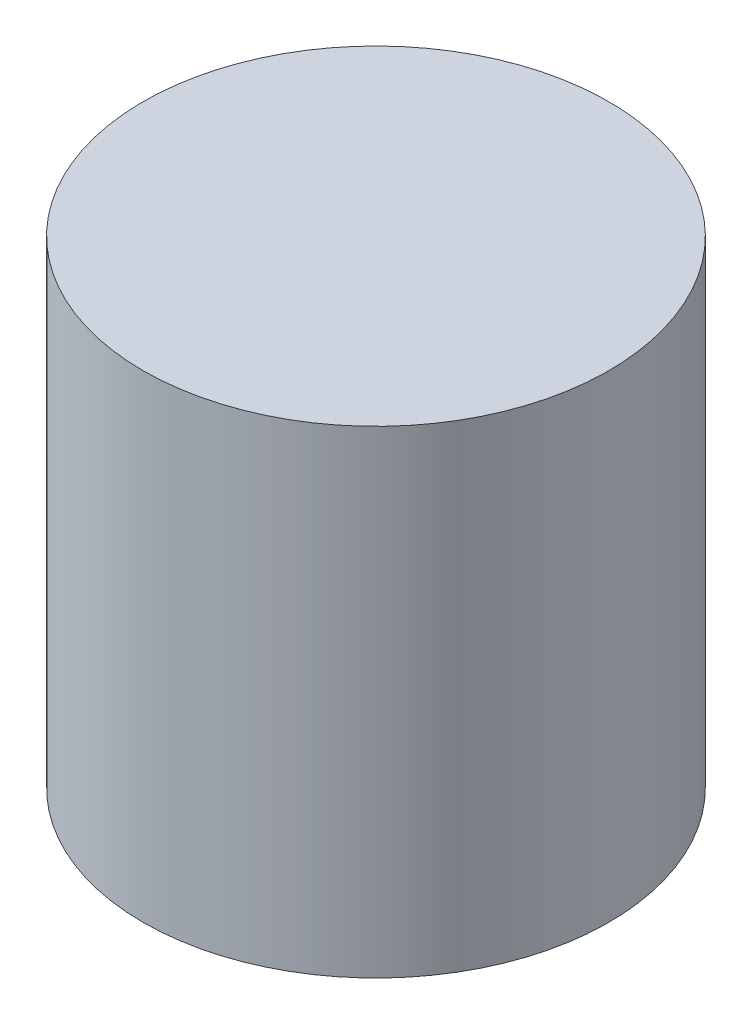
ISO-10303-21;
HEADER;
FILE_DESCRIPTION(('STEP AP214'),'2;1');
FILE_NAME('part.step','',(''),(''),'','','');
FILE_SCHEMA(('AUTOMOTIVE_DESIGN { 1 0 10303 214 1 1 1 1 }'));
ENDSEC;
DATA;
#1=APPLICATION_CONTEXT('core data for automotive mechanical design processes');
#2=APPLICATION_PROTOCOL_DEFINITION('international standard','automotive_design',2000,#1);
#3=PRODUCT_CONTEXT('',#1,'mechanical');
#4=PRODUCT('Part','Part','',(#3));
#5=PRODUCT_RELATED_PRODUCT_CATEGORY('part','',(#4));
#6=PRODUCT_DEFINITION_FORMATION('','',#4);
#7=PRODUCT_DEFINITION_CONTEXT('part definition',#1,'design');
#8=PRODUCT_DEFINITION('design','',#6,#7);
#9=PRODUCT_DEFINITION_SHAPE('','',#8);
#10=(LENGTH_UNIT() NAMED_UNIT(*) SI_UNIT(.MILLI.,.METRE.));
#11=(NAMED_UNIT(*) PLANE_ANGLE_UNIT() SI_UNIT($,.RADIAN.));
#12=(NAMED_UNIT(*) SI_UNIT($,.STERADIAN.) SOLID_ANGLE_UNIT());
#13=UNCERTAINTY_MEASURE_WITH_UNIT(LENGTH_MEASURE(1.E-05),#10,'distance_accuracy_value','');
#14=(GEOMETRIC_REPRESENTATION_CONTEXT(3) GLOBAL_UNCERTAINTY_ASSIGNED_CONTEXT((#13)) GLOBAL_UNIT_ASSIGNED_CONTEXT((#10,
#11,#12)) REPRESENTATION_CONTEXT('',''));
#15=CARTESIAN_POINT('',(0.,0.,0.));
#16=DIRECTION('',(0.,0.,1.));
#17=DIRECTION('',(1.,0.,0.));
#18=AXIS2_PLACEMENT_3D('',#15,#16,#17);
#19=CARTESIAN_POINT('',(0.,200.,0.));
#20=DIRECTION('',(0.,-1.,0.));
#21=DIRECTION('',(0.,0.,-1.));
#22=AXIS2_PLACEMENT_3D('',#19,#20,#21);
#23=CYLINDRICAL_SURFACE('',#22,97.5);
#24=CARTESIAN_POINT('',(0.,200.,0.));
#25=DIRECTION('',(0.,1.,0.));
#26=DIRECTION('',(0.,0.,1.));
#27=AXIS2_PLACEMENT_3D('',#24,#25,#26);
#28=CIRCLE('',#27,97.5);
#29=CARTESIAN_POINT('',(0.,200.,97.5));
#30=VERTEX_POINT('',#29);
#31=EDGE_CURVE('E10',#30,#30,#28,.T.);
#32=ORIENTED_EDGE('',*,*,#31,.F.);
#33=EDGE_LOOP('',(#32));
#34=FACE_BOUND('',#33,.T.);
#35=CARTESIAN_POINT('',(0.,0.,0.));
#36=DIRECTION('',(0.,1.,0.));
#37=DIRECTION('',(0.,0.,1.));
#38=AXIS2_PLACEMENT_3D('',#35,#36,#37);
#39=CIRCLE('',#38,97.5);
#40=CARTESIAN_POINT('',(0.,0.,97.5));
#41=VERTEX_POINT('',#40);
#42=EDGE_CURVE('E39',#41,#41,#39,.T.);
#43=ORIENTED_EDGE('',*,*,#42,.T.);
#44=EDGE_LOOP('',(#43));
#45=FACE_BOUND('',#44,.T.);
#46=ADVANCED_FACE('F36',(#34,#45),#23,.T.);
#47=CARTESIAN_POINT('',(0.,200.,0.));
#48=DIRECTION('',(0.,1.,0.));
#49=DIRECTION('',(0.,0.,1.));
#50=AXIS2_PLACEMENT_3D('',#47,#48,#49);
#51=PLANE('',#50);
#52=ORIENTED_EDGE('',*,*,#31,.T.);
#53=EDGE_LOOP('',(#52));
#54=FACE_BOUND('',#53,.T.);
#55=ADVANCED_FACE('F51',(#54),#51,.T.);
#56=CARTESIAN_POINT('',(0.,0.,0.));
#57=DIRECTION('',(0.,1.,0.));
#58=DIRECTION('',(0.,0.,1.));
#59=AXIS2_PLACEMENT_3D('',#56,#57,#58);
#60=PLANE('',#59);
#61=ORIENTED_EDGE('',*,*,#42,.F.);
#62=EDGE_LOOP('',(#61));
#63=FACE_BOUND('',#62,.T.);
#64=ADVANCED_FACE('F49',(#63),#60,.F.);
#65=CLOSED_SHELL('',(#46,#55,#64));
#66=MANIFOLD_SOLID_BREP('B2',#65);
#67=ADVANCED_BREP_SHAPE_REPRESENTATION('',(#18,#66),#14);
#68=SHAPE_DEFINITION_REPRESENTATION(#9,#67);
ENDSEC;
END-ISO-10303-21;
